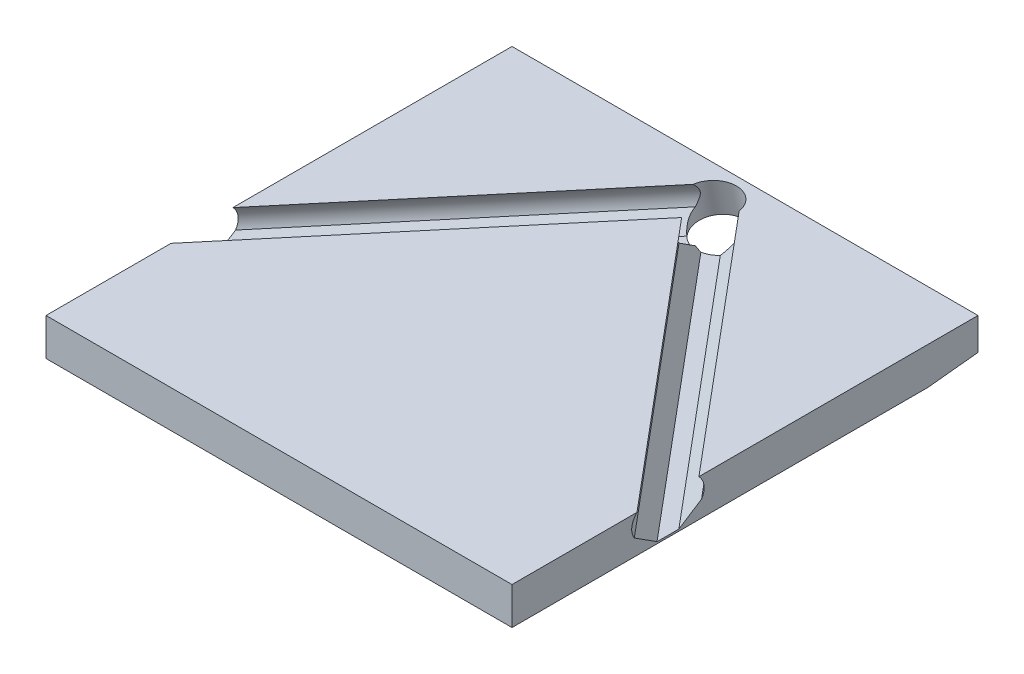
ISO-10303-21;
HEADER;
FILE_DESCRIPTION(('STEP AP214'),'2;1');
FILE_NAME('part.step','',(''),(''),'','','');
FILE_SCHEMA(('AUTOMOTIVE_DESIGN { 1 0 10303 214 1 1 1 1 }'));
ENDSEC;
DATA;
#1=APPLICATION_CONTEXT('core data for automotive mechanical design processes');
#2=APPLICATION_PROTOCOL_DEFINITION('international standard','automotive_design',2000,#1);
#3=PRODUCT_CONTEXT('',#1,'mechanical');
#4=PRODUCT('Part','Part','',(#3));
#5=PRODUCT_RELATED_PRODUCT_CATEGORY('part','',(#4));
#6=PRODUCT_DEFINITION_FORMATION('','',#4);
#7=PRODUCT_DEFINITION_CONTEXT('part definition',#1,'design');
#8=PRODUCT_DEFINITION('design','',#6,#7);
#9=PRODUCT_DEFINITION_SHAPE('','',#8);
#10=(LENGTH_UNIT() NAMED_UNIT(*) SI_UNIT(.MILLI.,.METRE.));
#11=(NAMED_UNIT(*) PLANE_ANGLE_UNIT() SI_UNIT($,.RADIAN.));
#12=(NAMED_UNIT(*) SI_UNIT($,.STERADIAN.) SOLID_ANGLE_UNIT());
#13=UNCERTAINTY_MEASURE_WITH_UNIT(LENGTH_MEASURE(1.E-05),#10,'distance_accuracy_value','');
#14=(GEOMETRIC_REPRESENTATION_CONTEXT(3) GLOBAL_UNCERTAINTY_ASSIGNED_CONTEXT((#13)) GLOBAL_UNIT_ASSIGNED_CONTEXT((#10,
#11,#12)) REPRESENTATION_CONTEXT('',''));
#15=CARTESIAN_POINT('',(0.,0.,0.));
#16=DIRECTION('',(0.,0.,1.));
#17=DIRECTION('',(1.,0.,0.));
#18=AXIS2_PLACEMENT_3D('',#15,#16,#17);
#19=CARTESIAN_POINT('',(0.,20.,0.));
#20=DIRECTION('',(0.,-1.,0.));
#21=DIRECTION('',(0.,0.,-1.));
#22=AXIS2_PLACEMENT_3D('',#19,#20,#21);
#23=PLANE('',#22);
#24=CARTESIAN_POINT('',(0.,20.,-107.622769024237));
#25=DIRECTION('',(0.,-1.,0.));
#26=DIRECTION('',(0.,0.,-1.));
#27=AXIS2_PLACEMENT_3D('',#24,#25,#26);
#28=ELLIPSE('',#27,12.7792574358128,12.5);
#29=CARTESIAN_POINT('',(-12.3647422840942,20.,-109.497628023604));
#30=VERTEX_POINT('',#29);
#31=CARTESIAN_POINT('',(12.3647422840941,20.,-109.497628023605));
#32=VERTEX_POINT('',#31);
#33=EDGE_CURVE('E254',#30,#32,#28,.T.);
#34=ORIENTED_EDGE('',*,*,#33,.T.);
#35=DIRECTION('',(-0.64278760968654,0.,-0.766044443118977));
#36=VECTOR('',#35,1.);
#37=CARTESIAN_POINT('',(174.370458590651,20.,83.5732664055318));
#38=LINE('',#37,#36);
#39=CARTESIAN_POINT('',(125.,20.,24.7358450121005));
#40=VERTEX_POINT('',#39);
#41=EDGE_CURVE('E312',#40,#32,#38,.T.);
#42=ORIENTED_EDGE('',*,*,#41,.F.);
#43=DIRECTION('',(0.,0.,-1.));
#44=VECTOR('',#43,1.);
#45=CARTESIAN_POINT('',(125.,20.,125.));
#46=LINE('',#45,#44);
#47=CARTESIAN_POINT('',(125.,20.,-125.));
#48=VERTEX_POINT('',#47);
#49=EDGE_CURVE('E270',#40,#48,#46,.T.);
#50=ORIENTED_EDGE('',*,*,#49,.T.);
#51=DIRECTION('',(-1.,0.,0.));
#52=VECTOR('',#51,1.);
#53=CARTESIAN_POINT('',(-125.,20.,-125.));
#54=LINE('',#53,#52);
#55=CARTESIAN_POINT('',(-125.,20.,-125.));
#56=VERTEX_POINT('',#55);
#57=EDGE_CURVE('E269',#48,#56,#54,.T.);
#58=ORIENTED_EDGE('',*,*,#57,.T.);
#59=DIRECTION('',(0.,0.,1.));
#60=VECTOR('',#59,1.);
#61=CARTESIAN_POINT('',(-125.,20.,125.));
#62=LINE('',#61,#60);
#63=CARTESIAN_POINT('',(-125.,20.,24.7358450121043));
#64=VERTEX_POINT('',#63);
#65=EDGE_CURVE('E273',#56,#64,#62,.T.);
#66=ORIENTED_EDGE('',*,*,#65,.T.);
#67=DIRECTION('',(0.64278760968653,0.,-0.766044443118986));
#68=VECTOR('',#67,1.);
#69=CARTESIAN_POINT('',(-174.370458590648,20.,83.5732664055347));
#70=LINE('',#69,#68);
#71=EDGE_CURVE('E224',#64,#30,#70,.T.);
#72=ORIENTED_EDGE('',*,*,#71,.T.);
#73=EDGE_LOOP('',(#34,#42,#50,#58,#66,#72));
#74=FACE_BOUND('',#73,.T.);
#75=ADVANCED_FACE('F33',(#74),#23,.F.);
#76=CARTESIAN_POINT('',(-125.,20.,125.));
#77=DIRECTION('',(1.,0.,0.));
#78=DIRECTION('',(0.,0.,-1.));
#79=AXIS2_PLACEMENT_3D('',#76,#77,#78);
#80=PLANE('',#79);
#81=CARTESIAN_POINT('',(-125.,13.5,41.3464300500428));
#82=DIRECTION('',(1.,0.,0.));
#83=DIRECTION('',(0.,0.,-1.));
#84=AXIS2_PLACEMENT_3D('',#81,#82,#83);
#85=ELLIPSE('',#84,19.4465478357555,12.5);
#86=CARTESIAN_POINT('',(-125.,8.83237363149247,23.3065216510025));
#87=VERTEX_POINT('',#86);
#88=EDGE_CURVE('E251',#64,#87,#85,.F.);
#89=ORIENTED_EDGE('',*,*,#88,.F.);
#90=ORIENTED_EDGE('',*,*,#65,.F.);
#91=DIRECTION('',(0.,-1.,0.));
#92=VECTOR('',#91,1.);
#93=CARTESIAN_POINT('',(-125.,20.,-125.));
#94=LINE('',#93,#92);
#95=CARTESIAN_POINT('',(-125.,2.82226850822647,-125.));
#96=VERTEX_POINT('',#95);
#97=EDGE_CURVE('E290',#56,#96,#94,.T.);
#98=ORIENTED_EDGE('',*,*,#97,.T.);
#99=DIRECTION('',(0.,-0.104528463267647,0.994521895368274));
#100=VECTOR('',#99,1.);
#101=CARTESIAN_POINT('',(-125.,0.,-98.1479088250566));
#102=LINE('',#101,#100);
#103=CARTESIAN_POINT('',(-125.,0.,-98.1479088250566));
#104=VERTEX_POINT('',#103);
#105=EDGE_CURVE('E257',#96,#104,#102,.T.);
#106=ORIENTED_EDGE('',*,*,#105,.T.);
#107=DIRECTION('',(0.,0.,1.));
#108=VECTOR('',#107,1.);
#109=CARTESIAN_POINT('',(-125.,0.,125.));
#110=LINE('',#109,#108);
#111=CARTESIAN_POINT('',(-125.,0.,125.));
#112=VERTEX_POINT('',#111);
#113=EDGE_CURVE('E281',#104,#112,#110,.T.);
#114=ORIENTED_EDGE('',*,*,#113,.T.);
#115=DIRECTION('',(0.,-1.,0.));
#116=VECTOR('',#115,1.);
#117=CARTESIAN_POINT('',(-125.,20.,125.));
#118=LINE('',#117,#116);
#119=CARTESIAN_POINT('',(-125.,20.,125.));
#120=VERTEX_POINT('',#119);
#121=EDGE_CURVE('E287',#120,#112,#118,.T.);
#122=ORIENTED_EDGE('',*,*,#121,.F.);
#123=CARTESIAN_POINT('',(-125.,20.,57.9570150879813));
#124=VERTEX_POINT('',#123);
#125=EDGE_CURVE('E272',#124,#120,#62,.T.);
#126=ORIENTED_EDGE('',*,*,#125,.F.);
#127=CARTESIAN_POINT('',(-125.,13.5,41.3464300500428));
#128=DIRECTION('',(1.,0.,0.));
#129=DIRECTION('',(0.,0.,-1.));
#130=AXIS2_PLACEMENT_3D('',#127,#128,#129);
#131=ELLIPSE('',#130,19.4465478357555,12.5);
#132=CARTESIAN_POINT('',(-125.,8.83237363149246,59.3863384490831));
#133=VERTEX_POINT('',#132);
#134=EDGE_CURVE('E243',#133,#124,#131,.F.);
#135=ORIENTED_EDGE('',*,*,#134,.F.);
#136=DIRECTION('',(0.,0.540716203060932,0.841205080671395));
#137=VECTOR('',#136,1.);
#138=CARTESIAN_POINT('',(-125.,41.9420824099609,110.895901296156));
#139=LINE('',#138,#137);
#140=CARTESIAN_POINT('',(-125.,1.,47.2013281696969));
#141=VERTEX_POINT('',#140);
#142=EDGE_CURVE('E245',#141,#133,#139,.T.);
#143=ORIENTED_EDGE('',*,*,#142,.F.);
#144=DIRECTION('',(0.,0.,1.));
#145=VECTOR('',#144,1.);
#146=CARTESIAN_POINT('',(-125.,1.,125.));
#147=LINE('',#146,#145);
#148=CARTESIAN_POINT('',(-125.,1.,35.4915319303887));
#149=VERTEX_POINT('',#148);
#150=EDGE_CURVE('E247',#149,#141,#147,.T.);
#151=ORIENTED_EDGE('',*,*,#150,.F.);
#152=DIRECTION('',(0.,-0.540716203060932,0.841205080671395));
#153=VECTOR('',#152,1.);
#154=CARTESIAN_POINT('',(-125.,-34.1581084367564,90.1878389327933));
#155=LINE('',#154,#153);
#156=EDGE_CURVE('E249',#87,#149,#155,.T.);
#157=ORIENTED_EDGE('',*,*,#156,.F.);
#158=EDGE_LOOP('',(#89,#90,#98,#106,#114,#122,#126,#135,#143,#151,#157));
#159=FACE_BOUND('',#158,.T.);
#160=ADVANCED_FACE('F315',(#159),#80,.F.);
#161=CARTESIAN_POINT('',(125.,20.,125.));
#162=VERTEX_POINT('',#161);
#163=CARTESIAN_POINT('',(125.,20.,57.9570150879769));
#164=VERTEX_POINT('',#163);
#165=EDGE_CURVE('E266',#162,#164,#46,.T.);
#166=ORIENTED_EDGE('',*,*,#165,.T.);
#167=DIRECTION('',(-0.64278760968654,0.,-0.766044443118977));
#168=VECTOR('',#167,1.);
#169=CARTESIAN_POINT('',(158.01222566322,20.,97.2994536216505));
#170=LINE('',#169,#168);
#171=CARTESIAN_POINT('',(0.,20.,-91.0121839862988));
#172=VERTEX_POINT('',#171);
#173=EDGE_CURVE('E330',#164,#172,#170,.T.);
#174=ORIENTED_EDGE('',*,*,#173,.T.);
#175=DIRECTION('',(0.64278760968653,0.,-0.766044443118986));
#176=VECTOR('',#175,1.);
#177=CARTESIAN_POINT('',(-158.012225663218,20.,97.2994536216532));
#178=LINE('',#177,#176);
#179=EDGE_CURVE('E228',#124,#172,#178,.T.);
#180=ORIENTED_EDGE('',*,*,#179,.F.);
#181=ORIENTED_EDGE('',*,*,#125,.T.);
#182=DIRECTION('',(1.,0.,0.));
#183=VECTOR('',#182,1.);
#184=CARTESIAN_POINT('',(-125.,20.,125.));
#185=LINE('',#184,#183);
#186=EDGE_CURVE('E276',#120,#162,#185,.T.);
#187=ORIENTED_EDGE('',*,*,#186,.T.);
#188=EDGE_LOOP('',(#166,#174,#180,#181,#187));
#189=FACE_BOUND('',#188,.T.);
#190=ADVANCED_FACE('F329',(#189),#23,.F.);
#191=CARTESIAN_POINT('',(0.,67.3081020879564,-97.567121505287));
#192=DIRECTION('',(0.,-0.978147600733807,-0.207911690817753));
#193=DIRECTION('',(0.,0.207911690817753,-0.978147600733807));
#194=AXIS2_PLACEMENT_3D('',#191,#192,#193);
#195=CYLINDRICAL_SURFACE('',#194,12.5);
#196=CARTESIAN_POINT('',(0.,1.41113425411322,-111.573954412528));
#197=DIRECTION('',(0.,0.994521895368274,0.104528463267647));
#198=DIRECTION('',(0.,0.104528463267647,-0.994521895368274));
#199=AXIS2_PLACEMENT_3D('',#196,#197,#198);
#200=ELLIPSE('',#199,12.568853494544,12.5);
#201=CARTESIAN_POINT('',(0.,2.7249371949341,-124.073954412528));
#202=VERTEX_POINT('',#201);
#203=EDGE_CURVE('E253',#202,#202,#200,.T.);
#204=ORIENTED_EDGE('',*,*,#203,.F.);
#205=EDGE_LOOP('',(#204));
#206=FACE_BOUND('',#205,.T.);
#207=CARTESIAN_POINT('',(0.,-0.0271693673157963,-111.879675284937));
#208=DIRECTION('',(0.541675220419703,-0.707106781186545,-0.454519477672046));
#209=DIRECTION('',(-0.689029180719739,-0.683223218529419,0.241753638605475));
#210=AXIS2_PLACEMENT_3D('',#207,#208,#209);
#211=ELLIPSE('',#210,15.9001781303028,12.5);
#212=CARTESIAN_POINT('',(8.981785849563,1.,-102.773591589763));
#213=VERTEX_POINT('',#212);
#214=CARTESIAN_POINT('',(12.4755847306921,8.83237363149249,-110.794854500761));
#215=VERTEX_POINT('',#214);
#216=EDGE_CURVE('E343',#213,#215,#211,.F.);
#217=ORIENTED_EDGE('',*,*,#216,.T.);
#218=CARTESIAN_POINT('',(12.4755847306921,8.83237363149249,-110.794854500761));
#219=CARTESIAN_POINT('',(12.4648743424763,9.02624699275766,-110.928989366624));
#220=CARTESIAN_POINT('',(12.450738008659,9.22224607409211,-111.059821205916));
#221=CARTESIAN_POINT('',(12.4164957910381,9.61892271071571,-111.31371791369));
#222=CARTESIAN_POINT('',(12.3963850869966,9.81960392270352,-111.436776412898));
#223=CARTESIAN_POINT('',(12.3506284990318,10.229957925221,-111.67619420506));
#224=CARTESIAN_POINT('',(12.324876765416,10.4397308352499,-111.792362374131));
#225=CARTESIAN_POINT('',(12.269354999648,10.8646854025729,-112.013215349565));
#226=CARTESIAN_POINT('',(12.2395861298773,11.079865480669,-112.117903461922));
#227=CARTESIAN_POINT('',(12.1827150122329,11.4806734313091,-112.297264889555));
#228=CARTESIAN_POINT('',(12.1559687187927,11.6654030124678,-112.374049342405));
#229=CARTESIAN_POINT('',(12.1020681701513,12.0394322605579,-112.515657112121));
#230=CARTESIAN_POINT('',(12.0749138362894,12.228732813048,-112.580478089869));
#231=CARTESIAN_POINT('',(12.0219980102449,12.6106470677967,-112.695051109008));
#232=CARTESIAN_POINT('',(11.9962281937633,12.8032288588239,-112.744904130569));
#233=CARTESIAN_POINT('',(11.9478483553744,13.1925223975972,-112.82689824172));
#234=CARTESIAN_POINT('',(11.9252362189182,13.3892312791072,-112.859051227048));
#235=CARTESIAN_POINT('',(11.891495564315,13.7243253588,-112.895621436744));
#236=CARTESIAN_POINT('',(11.8789767596219,13.8619729526311,-112.90553622686));
#237=CARTESIAN_POINT('',(11.8571583346082,14.1378609592707,-112.914356631278));
#238=CARTESIAN_POINT('',(11.8478576205574,14.2761011544687,-112.913265989799));
#239=CARTESIAN_POINT('',(11.8330034159519,14.5520562792821,-112.899487575695));
#240=CARTESIAN_POINT('',(11.8274456035845,14.6897716315045,-112.886813218444));
#241=CARTESIAN_POINT('',(11.8203257732398,14.96373387145,-112.849803606668));
#242=CARTESIAN_POINT('',(11.8187638634707,15.099980719307,-112.825468036383));
#243=CARTESIAN_POINT('',(11.8195949985817,15.3694749134323,-112.76571695511));
#244=CARTESIAN_POINT('',(11.8219736123873,15.5027314010167,-112.730342256644));
#245=CARTESIAN_POINT('',(11.8303395514065,15.7660172376679,-112.649393619874));
#246=CARTESIAN_POINT('',(11.8363284808859,15.8960451253272,-112.603815153126));
#247=CARTESIAN_POINT('',(11.8590040560242,16.2810806988433,-112.453281102619));
#248=CARTESIAN_POINT('',(11.880394358361,16.5305067654355,-112.334652626141));
#249=CARTESIAN_POINT('',(11.930223968475,17.0076941565962,-112.073952006935));
#250=CARTESIAN_POINT('',(11.958482881031,17.2358304381755,-111.932506867876));
#251=CARTESIAN_POINT('',(12.0183571626473,17.6791574296129,-111.630953556777));
#252=CARTESIAN_POINT('',(12.0499762281722,17.8943334658634,-111.47082481176));
#253=CARTESIAN_POINT('',(12.1136540966491,18.3139216936677,-111.136337957903));
#254=CARTESIAN_POINT('',(12.1457137275861,18.5183086305641,-110.961948705051));
#255=CARTESIAN_POINT('',(12.2080178321911,18.9174602278427,-110.602438039882));
#256=CARTESIAN_POINT('',(12.2382632350133,19.1122298045457,-110.417322218336));
#257=CARTESIAN_POINT('',(12.2847030431635,19.4223986620704,-110.109062069792));
#258=CARTESIAN_POINT('',(12.3019294754951,19.5402973583522,-109.988566139207));
#259=CARTESIAN_POINT('',(12.3346679042662,19.7725784032778,-109.745032826571));
#260=CARTESIAN_POINT('',(12.3501871733182,19.8869740404749,-109.622009104232));
#261=CARTESIAN_POINT('',(12.3647422840942,20.,-109.497628023605));
#262=B_SPLINE_CURVE_WITH_KNOTS('',3,(#218,#219,#220,#221,#222,#223,#224,#225,#226,#227,#228,
#229,#230,#231,#232,#233,#234,#235,#236,#237,#238,#239,#240,#241,#242,#243,#244,#245,#246,#247,
#248,#249,#250,#251,#252,#253,#254,#255,#256,#257,#258,#259,#260,#261),.UNSPECIFIED.,.F.,.F.,(4,
2,2,2,2,2,2,2,2,2,2,2,2,2,2,2,2,2,2,2,2,4),(0.,0.707965718568415,1.41650419615835,
2.13969265308808,2.86267229821533,3.46783865625631,4.07312321230637,4.67422743440775,
5.27492717510848,5.69022310618073,6.10537775195164,6.5200522057919,6.93473788879115,
7.34790825514169,7.76126235172814,8.58959707034554,9.39816480119278,10.2076314208177,
11.018915661052,11.8297807919688,12.3380996822119,12.844161600065),.UNSPECIFIED.);
#263=EDGE_CURVE('E217',#215,#32,#262,.T.);
#264=ORIENTED_EDGE('',*,*,#263,.T.);
#265=ORIENTED_EDGE('',*,*,#33,.F.);
#266=CARTESIAN_POINT('',(-12.475584730692,8.83237363149246,-110.794854500761));
#267=CARTESIAN_POINT('',(-12.4648743424762,9.02624699275767,-110.928989366624));
#268=CARTESIAN_POINT('',(-12.4507380086589,9.22224607409211,-111.059821205916));
#269=CARTESIAN_POINT('',(-12.4164957910381,9.61892271071571,-111.31371791369));
#270=CARTESIAN_POINT('',(-12.3963850869966,9.81960392270351,-111.436776412898));
#271=CARTESIAN_POINT('',(-12.3506284990318,10.229957925221,-111.676194205059));
#272=CARTESIAN_POINT('',(-12.324876765416,10.4397308352499,-111.792362374131));
#273=CARTESIAN_POINT('',(-12.269354999648,10.8646854025729,-112.013215349565));
#274=CARTESIAN_POINT('',(-12.2395861298773,11.079865480669,-112.117903461922));
#275=CARTESIAN_POINT('',(-12.1827150122329,11.4806734313091,-112.297264889555));
#276=CARTESIAN_POINT('',(-12.1559687187927,11.6654030124678,-112.374049342405));
#277=CARTESIAN_POINT('',(-12.1020681701513,12.0394322605578,-112.515657112121));
#278=CARTESIAN_POINT('',(-12.0749138362894,12.228732813048,-112.580478089869));
#279=CARTESIAN_POINT('',(-12.0219980102449,12.6106470677967,-112.695051109008));
#280=CARTESIAN_POINT('',(-11.9962281937633,12.8032288588239,-112.744904130569));
#281=CARTESIAN_POINT('',(-11.9478483553744,13.1925223975972,-112.82689824172));
#282=CARTESIAN_POINT('',(-11.9252362189182,13.3892312791073,-112.859051227048));
#283=CARTESIAN_POINT('',(-11.891495564315,13.7243253588001,-112.895621436744));
#284=CARTESIAN_POINT('',(-11.8789767596219,13.8619729526311,-112.90553622686));
#285=CARTESIAN_POINT('',(-11.8571583346082,14.1378609592707,-112.914356631278));
#286=CARTESIAN_POINT('',(-11.8478576205573,14.2761011544687,-112.913265989799));
#287=CARTESIAN_POINT('',(-11.8330034159519,14.5520562792822,-112.899487575695));
#288=CARTESIAN_POINT('',(-11.8274456035845,14.6897716315045,-112.886813218444));
#289=CARTESIAN_POINT('',(-11.8203257732398,14.9637338714501,-112.849803606668));
#290=CARTESIAN_POINT('',(-11.8187638634706,15.099980719307,-112.825468036383));
#291=CARTESIAN_POINT('',(-11.8195949985817,15.3694749134323,-112.76571695511));
#292=CARTESIAN_POINT('',(-11.8219736123872,15.5027314010167,-112.730342256644));
#293=CARTESIAN_POINT('',(-11.8303395514064,15.7660172376679,-112.649393619874));
#294=CARTESIAN_POINT('',(-11.8363284808858,15.8960451253272,-112.603815153126));
#295=CARTESIAN_POINT('',(-11.8590040560241,16.2810806988433,-112.453281102619));
#296=CARTESIAN_POINT('',(-11.880394358361,16.5305067654355,-112.33465262614));
#297=CARTESIAN_POINT('',(-11.930223968475,17.0076941565962,-112.073952006935));
#298=CARTESIAN_POINT('',(-11.958482881031,17.2358304381756,-111.932506867876));
#299=CARTESIAN_POINT('',(-12.0183571626473,17.679157429613,-111.630953556777));
#300=CARTESIAN_POINT('',(-12.0499762281722,17.8943334658634,-111.47082481176));
#301=CARTESIAN_POINT('',(-12.1136540966491,18.3139216936678,-111.136337957903));
#302=CARTESIAN_POINT('',(-12.1457137275861,18.5183086305642,-110.961948705051));
#303=CARTESIAN_POINT('',(-12.2080178321911,18.9174602278428,-110.602438039882));
#304=CARTESIAN_POINT('',(-12.2382632350133,19.1122298045458,-110.417322218336));
#305=CARTESIAN_POINT('',(-12.2847030431635,19.4223986620705,-110.109062069792));
#306=CARTESIAN_POINT('',(-12.3019294754951,19.5402973583522,-109.988566139207));
#307=CARTESIAN_POINT('',(-12.3346679042662,19.7725784032779,-109.745032826571));
#308=CARTESIAN_POINT('',(-12.3501871733182,19.8869740404749,-109.622009104232));
#309=CARTESIAN_POINT('',(-12.3647422840941,20.,-109.497628023605));
#310=B_SPLINE_CURVE_WITH_KNOTS('',3,(#266,#267,#268,#269,#270,#271,#272,#273,#274,#275,#276,
#277,#278,#279,#280,#281,#282,#283,#284,#285,#286,#287,#288,#289,#290,#291,#292,#293,#294,#295,
#296,#297,#298,#299,#300,#301,#302,#303,#304,#305,#306,#307,#308,#309),.UNSPECIFIED.,.F.,.F.,(4,
2,2,2,2,2,2,2,2,2,2,2,2,2,2,2,2,2,2,2,2,4),(0.,0.707965718568424,1.41650419615837,
2.13969265308806,2.86267229821532,3.46783865625631,4.07312321230637,4.67422743440776,
5.27492717510852,5.69022310618078,6.10537775195168,6.52005220579192,6.93473788879116,
7.34790825514169,7.76126235172814,8.58959707034555,9.39816480119284,10.2076314208178,
11.0189156610522,11.829780791969,12.338099682212,12.8441616000651),.UNSPECIFIED.);
#311=CARTESIAN_POINT('',(-12.4755847306921,8.83237363149247,-110.794854500761));
#312=VERTEX_POINT('',#311);
#313=EDGE_CURVE('E175',#312,#30,#310,.T.);
#314=ORIENTED_EDGE('',*,*,#313,.F.);
#315=CARTESIAN_POINT('',(0.,-0.0271693673158241,-111.879675284937));
#316=DIRECTION('',(0.541675220419708,0.707106781186546,0.454519477672038));
#317=DIRECTION('',(0.689029180719745,-0.683223218529417,0.241753638605464));
#318=AXIS2_PLACEMENT_3D('',#315,#316,#317);
#319=ELLIPSE('',#318,15.9001781303028,12.5);
#320=CARTESIAN_POINT('',(-8.98178584956288,1.,-102.773591589763));
#321=VERTEX_POINT('',#320);
#322=EDGE_CURVE('E182',#321,#312,#319,.F.);
#323=ORIENTED_EDGE('',*,*,#322,.F.);
#324=CARTESIAN_POINT('',(0.,1.,-111.661343695967));
#325=DIRECTION('',(0.,1.,0.));
#326=DIRECTION('',(0.,0.,-1.));
#327=AXIS2_PLACEMENT_3D('',#324,#325,#326);
#328=ELLIPSE('',#327,12.7792574358128,12.5);
#329=CARTESIAN_POINT('',(-2.246816165865,1.,-99.0902196670146));
#330=VERTEX_POINT('',#329);
#331=EDGE_CURVE('E299',#330,#321,#328,.F.);
#332=ORIENTED_EDGE('',*,*,#331,.F.);
#333=CARTESIAN_POINT('',(0.,-6.36577866940634,-113.226988283959));
#334=DIRECTION('',(-0.541675220419708,0.707106781186547,-0.454519477672038));
#335=DIRECTION('',(-0.403258373417666,-0.693027485157282,-0.597574756064136));
#336=AXIS2_PLACEMENT_3D('',#333,#334,#335);
#337=ELLIPSE('',#336,20.9325926045176,12.5);
#338=CARTESIAN_POINT('',(1.00511862689389E-13,3.14849238752064,-98.4254101054889));
#339=VERTEX_POINT('',#338);
#340=EDGE_CURVE('E296',#339,#330,#337,.F.);
#341=ORIENTED_EDGE('',*,*,#340,.F.);
#342=CARTESIAN_POINT('',(0.,-6.36577866940641,-113.226988283959));
#343=DIRECTION('',(-0.541675220419702,-0.707106781186546,0.454519477672045));
#344=DIRECTION('',(0.403258373417659,-0.693027485157284,-0.597574756064139));
#345=AXIS2_PLACEMENT_3D('',#342,#343,#344);
#346=ELLIPSE('',#345,20.9325926045177,12.5);
#347=CARTESIAN_POINT('',(2.24681616586508,1.,-99.0902196670147));
#348=VERTEX_POINT('',#347);
#349=EDGE_CURVE('E158',#339,#348,#346,.F.);
#350=ORIENTED_EDGE('',*,*,#349,.T.);
#351=CARTESIAN_POINT('',(0.,1.,-111.661343695967));
#352=DIRECTION('',(0.,-1.,0.));
#353=DIRECTION('',(0.,0.,-1.));
#354=AXIS2_PLACEMENT_3D('',#351,#352,#353);
#355=ELLIPSE('',#354,12.7792574358128,12.5);
#356=EDGE_CURVE('E165',#348,#213,#355,.F.);
#357=ORIENTED_EDGE('',*,*,#356,.T.);
#358=EDGE_LOOP('',(#217,#264,#265,#314,#323,#332,#341,#350,#357));
#359=FACE_BOUND('',#358,.T.);
#360=ADVANCED_FACE('F184',(#206,#359),#195,.F.);
#361=CARTESIAN_POINT('',(125.,20.,125.));
#362=DIRECTION('',(-1.,0.,0.));
#363=DIRECTION('',(0.,0.,1.));
#364=AXIS2_PLACEMENT_3D('',#361,#362,#363);
#365=PLANE('',#364);
#366=ORIENTED_EDGE('',*,*,#49,.F.);
#367=CARTESIAN_POINT('',(125.,13.5,41.3464300500387));
#368=DIRECTION('',(-1.,0.,0.));
#369=DIRECTION('',(0.,0.,-1.));
#370=AXIS2_PLACEMENT_3D('',#367,#368,#369);
#371=ELLIPSE('',#370,19.4465478357551,12.5);
#372=CARTESIAN_POINT('',(125.,8.83237363149249,23.3065216509987));
#373=VERTEX_POINT('',#372);
#374=EDGE_CURVE('E11',#40,#373,#371,.T.);
#375=ORIENTED_EDGE('',*,*,#374,.T.);
#376=DIRECTION('',(0.,-0.54071620306094,0.84120508067139));
#377=VECTOR('',#376,1.);
#378=CARTESIAN_POINT('',(125.,-34.1581084367584,90.1878389327913));
#379=LINE('',#378,#377);
#380=CARTESIAN_POINT('',(125.,0.999999999999997,35.4915319303847));
#381=VERTEX_POINT('',#380);
#382=EDGE_CURVE('E170',#373,#381,#379,.T.);
#383=ORIENTED_EDGE('',*,*,#382,.T.);
#384=DIRECTION('',(0.,0.,1.));
#385=VECTOR('',#384,1.);
#386=CARTESIAN_POINT('',(125.,1.,125.));
#387=LINE('',#386,#385);
#388=CARTESIAN_POINT('',(125.,1.,47.2013281696927));
#389=VERTEX_POINT('',#388);
#390=EDGE_CURVE('E41',#381,#389,#387,.T.);
#391=ORIENTED_EDGE('',*,*,#390,.T.);
#392=DIRECTION('',(0.,0.540716203060939,0.841205080671391));
#393=VECTOR('',#392,1.);
#394=CARTESIAN_POINT('',(125.,41.9420824099632,110.895901296155));
#395=LINE('',#394,#393);
#396=CARTESIAN_POINT('',(125.,8.83237363149247,59.3863384490787));
#397=VERTEX_POINT('',#396);
#398=EDGE_CURVE('E149',#389,#397,#395,.T.);
#399=ORIENTED_EDGE('',*,*,#398,.T.);
#400=CARTESIAN_POINT('',(125.,13.5,41.3464300500387));
#401=DIRECTION('',(-1.,0.,0.));
#402=DIRECTION('',(0.,0.,-1.));
#403=AXIS2_PLACEMENT_3D('',#400,#401,#402);
#404=ELLIPSE('',#403,19.4465478357551,12.5);
#405=EDGE_CURVE('E157',#397,#164,#404,.T.);
#406=ORIENTED_EDGE('',*,*,#405,.T.);
#407=ORIENTED_EDGE('',*,*,#165,.F.);
#408=DIRECTION('',(0.,-1.,0.));
#409=VECTOR('',#408,1.);
#410=CARTESIAN_POINT('',(125.,20.,125.));
#411=LINE('',#410,#409);
#412=CARTESIAN_POINT('',(125.,0.,125.));
#413=VERTEX_POINT('',#412);
#414=EDGE_CURVE('E278',#162,#413,#411,.T.);
#415=ORIENTED_EDGE('',*,*,#414,.T.);
#416=DIRECTION('',(0.,0.,-1.));
#417=VECTOR('',#416,1.);
#418=CARTESIAN_POINT('',(125.,0.,125.));
#419=LINE('',#418,#417);
#420=CARTESIAN_POINT('',(125.,0.,-98.1479088250566));
#421=VERTEX_POINT('',#420);
#422=EDGE_CURVE('E264',#413,#421,#419,.T.);
#423=ORIENTED_EDGE('',*,*,#422,.T.);
#424=DIRECTION('',(0.,-0.104528463267647,0.994521895368274));
#425=VECTOR('',#424,1.);
#426=CARTESIAN_POINT('',(125.,0.,-98.1479088250566));
#427=LINE('',#426,#425);
#428=CARTESIAN_POINT('',(125.,2.82226850822647,-125.));
#429=VERTEX_POINT('',#428);
#430=EDGE_CURVE('E56',#429,#421,#427,.T.);
#431=ORIENTED_EDGE('',*,*,#430,.F.);
#432=DIRECTION('',(0.,-1.,0.));
#433=VECTOR('',#432,1.);
#434=CARTESIAN_POINT('',(125.,20.,-125.));
#435=LINE('',#434,#433);
#436=EDGE_CURVE('E293',#48,#429,#435,.T.);
#437=ORIENTED_EDGE('',*,*,#436,.F.);
#438=EDGE_LOOP('',(#366,#375,#383,#391,#399,#406,#407,#415,#423,#431,#437));
#439=FACE_BOUND('',#438,.T.);
#440=ADVANCED_FACE('F35',(#439),#365,.F.);
#441=CARTESIAN_POINT('',(-125.,20.,-125.));
#442=DIRECTION('',(0.,0.,1.));
#443=DIRECTION('',(1.,0.,0.));
#444=AXIS2_PLACEMENT_3D('',#441,#442,#443);
#445=PLANE('',#444);
#446=ORIENTED_EDGE('',*,*,#436,.T.);
#447=DIRECTION('',(1.,0.,0.));
#448=VECTOR('',#447,1.);
#449=CARTESIAN_POINT('',(-125.,2.82226850822647,-125.));
#450=LINE('',#449,#448);
#451=EDGE_CURVE('E262',#96,#429,#450,.T.);
#452=ORIENTED_EDGE('',*,*,#451,.F.);
#453=ORIENTED_EDGE('',*,*,#97,.F.);
#454=ORIENTED_EDGE('',*,*,#57,.F.);
#455=EDGE_LOOP('',(#446,#452,#453,#454));
#456=FACE_BOUND('',#455,.T.);
#457=ADVANCED_FACE('F368',(#456),#445,.F.);
#458=CARTESIAN_POINT('',(-125.,20.,125.));
#459=DIRECTION('',(0.,0.,-1.));
#460=DIRECTION('',(-1.,0.,0.));
#461=AXIS2_PLACEMENT_3D('',#458,#459,#460);
#462=PLANE('',#461);
#463=DIRECTION('',(1.,0.,0.));
#464=VECTOR('',#463,1.);
#465=CARTESIAN_POINT('',(-125.,0.,125.));
#466=LINE('',#465,#464);
#467=EDGE_CURVE('E283',#112,#413,#466,.T.);
#468=ORIENTED_EDGE('',*,*,#467,.T.);
#469=ORIENTED_EDGE('',*,*,#414,.F.);
#470=ORIENTED_EDGE('',*,*,#186,.F.);
#471=ORIENTED_EDGE('',*,*,#121,.T.);
#472=EDGE_LOOP('',(#468,#469,#470,#471));
#473=FACE_BOUND('',#472,.T.);
#474=ADVANCED_FACE('F376',(#473),#462,.F.);
#475=CARTESIAN_POINT('',(0.,0.,0.));
#476=DIRECTION('',(0.,-1.,0.));
#477=DIRECTION('',(0.,0.,-1.));
#478=AXIS2_PLACEMENT_3D('',#475,#476,#477);
#479=PLANE('',#478);
#480=DIRECTION('',(1.,0.,0.));
#481=VECTOR('',#480,1.);
#482=CARTESIAN_POINT('',(-125.,0.,-98.1479088250566));
#483=LINE('',#482,#481);
#484=EDGE_CURVE('E260',#104,#421,#483,.T.);
#485=ORIENTED_EDGE('',*,*,#484,.T.);
#486=ORIENTED_EDGE('',*,*,#422,.F.);
#487=ORIENTED_EDGE('',*,*,#467,.F.);
#488=ORIENTED_EDGE('',*,*,#113,.F.);
#489=EDGE_LOOP('',(#485,#486,#487,#488));
#490=FACE_BOUND('',#489,.T.);
#491=ADVANCED_FACE('F372',(#490),#479,.T.);
#492=CARTESIAN_POINT('',(-125.,0.,-98.1479088250566));
#493=DIRECTION('',(0.,0.994521895368274,0.104528463267647));
#494=DIRECTION('',(0.,-0.104528463267647,0.994521895368274));
#495=AXIS2_PLACEMENT_3D('',#492,#493,#494);
#496=PLANE('',#495);
#497=ORIENTED_EDGE('',*,*,#203,.T.);
#498=EDGE_LOOP('',(#497));
#499=FACE_BOUND('',#498,.T.);
#500=ORIENTED_EDGE('',*,*,#430,.T.);
#501=ORIENTED_EDGE('',*,*,#484,.F.);
#502=ORIENTED_EDGE('',*,*,#105,.F.);
#503=ORIENTED_EDGE('',*,*,#451,.T.);
#504=EDGE_LOOP('',(#500,#501,#502,#503));
#505=FACE_BOUND('',#504,.T.);
#506=ADVANCED_FACE('F192',(#499,#505),#496,.F.);
#507=CARTESIAN_POINT('',(-166.191342126933,13.5,90.436360013594));
#508=DIRECTION('',(0.64278760968653,0.,-0.766044443118986));
#509=DIRECTION('',(-0.766044443118986,0.,-0.64278760968653));
#510=AXIS2_PLACEMENT_3D('',#507,#508,#509);
#511=CYLINDRICAL_SURFACE('',#510,12.5);
#512=ORIENTED_EDGE('',*,*,#88,.T.);
#513=DIRECTION('',(0.64278760968653,0.,-0.766044443118986));
#514=VECTOR('',#513,1.);
#515=CARTESIAN_POINT('',(-175.074262954436,8.83237363149247,82.9827044234599));
#516=LINE('',#515,#514);
#517=EDGE_CURVE('E240',#87,#312,#516,.T.);
#518=ORIENTED_EDGE('',*,*,#517,.T.);
#519=ORIENTED_EDGE('',*,*,#313,.T.);
#520=ORIENTED_EDGE('',*,*,#71,.F.);
#521=EDGE_LOOP('',(#512,#518,#519,#520));
#522=FACE_BOUND('',#521,.T.);
#523=ADVANCED_FACE('F187',(#522),#511,.F.);
#524=CARTESIAN_POINT('',(-175.074262954436,8.83237363149247,82.9827044234599));
#525=DIRECTION('',(0.541675220419708,0.707106781186546,0.454519477672038));
#526=DIRECTION('',(-0.793844806099442,0.608120402411348,0.));
#527=AXIS2_PLACEMENT_3D('',#524,#525,#526);
#528=PLANE('',#527);
#529=ORIENTED_EDGE('',*,*,#156,.T.);
#530=DIRECTION('',(0.64278760968653,0.,-0.766044443118986));
#531=VECTOR('',#530,1.);
#532=CARTESIAN_POINT('',(-169.074316657599,1.,88.0172571482187));
#533=LINE('',#532,#531);
#534=EDGE_CURVE('E237',#149,#321,#533,.T.);
#535=ORIENTED_EDGE('',*,*,#534,.T.);
#536=ORIENTED_EDGE('',*,*,#322,.T.);
#537=ORIENTED_EDGE('',*,*,#517,.F.);
#538=EDGE_LOOP('',(#529,#535,#536,#537));
#539=FACE_BOUND('',#538,.T.);
#540=ADVANCED_FACE('F191',(#539),#528,.T.);
#541=CARTESIAN_POINT('',(-169.074316657599,1.,88.0172571482187));
#542=DIRECTION('',(0.,1.,0.));
#543=DIRECTION('',(0.,0.,1.));
#544=AXIS2_PLACEMENT_3D('',#541,#542,#543);
#545=PLANE('',#544);
#546=ORIENTED_EDGE('',*,*,#150,.T.);
#547=DIRECTION('',(0.64278760968653,0.,-0.766044443118986));
#548=VECTOR('',#547,1.);
#549=CARTESIAN_POINT('',(-163.308367596267,1.,92.8554628789692));
#550=LINE('',#549,#548);
#551=EDGE_CURVE('E234',#141,#330,#550,.T.);
#552=ORIENTED_EDGE('',*,*,#551,.T.);
#553=ORIENTED_EDGE('',*,*,#331,.T.);
#554=ORIENTED_EDGE('',*,*,#534,.F.);
#555=EDGE_LOOP('',(#546,#552,#553,#554));
#556=FACE_BOUND('',#555,.T.);
#557=ADVANCED_FACE('F196',(#556),#545,.T.);
#558=CARTESIAN_POINT('',(-163.308367596267,1.,92.8554628789692));
#559=DIRECTION('',(-0.541675220419708,0.707106781186547,-0.454519477672038));
#560=DIRECTION('',(-0.793844806099442,-0.608120402411348,0.));
#561=AXIS2_PLACEMENT_3D('',#558,#559,#560);
#562=PLANE('',#561);
#563=DIRECTION('',(0.,0.540716203060936,0.841205080671393));
#564=VECTOR('',#563,1.);
#565=CARTESIAN_POINT('',(1.13797860024079E-12,89.5250495167912,35.9526579026873));
#566=LINE('',#565,#564);
#567=CARTESIAN_POINT('',(1.66533453693773E-13,8.83237363149246,-89.582860625197));
#568=VERTEX_POINT('',#567);
#569=EDGE_CURVE('E333',#339,#568,#566,.T.);
#570=ORIENTED_EDGE('',*,*,#569,.F.);
#571=ORIENTED_EDGE('',*,*,#340,.T.);
#572=ORIENTED_EDGE('',*,*,#551,.F.);
#573=ORIENTED_EDGE('',*,*,#142,.T.);
#574=DIRECTION('',(0.64278760968653,0.,-0.766044443118986));
#575=VECTOR('',#574,1.);
#576=CARTESIAN_POINT('',(-157.308421299431,8.83237363149246,97.890015603728));
#577=LINE('',#576,#575);
#578=EDGE_CURVE('E231',#133,#568,#577,.T.);
#579=ORIENTED_EDGE('',*,*,#578,.T.);
#580=EDGE_LOOP('',(#570,#571,#572,#573,#579));
#581=FACE_BOUND('',#580,.T.);
#582=ADVANCED_FACE('F200',(#581),#562,.T.);
#583=CARTESIAN_POINT('',(-166.191342126933,13.5,90.436360013594));
#584=DIRECTION('',(0.64278760968653,0.,-0.766044443118986));
#585=DIRECTION('',(-0.766044443118986,0.,-0.64278760968653));
#586=AXIS2_PLACEMENT_3D('',#583,#584,#585);
#587=CYLINDRICAL_SURFACE('',#586,12.5);
#588=CARTESIAN_POINT('',(0.,13.5,-107.622769024237));
#589=DIRECTION('',(1.,0.,0.));
#590=DIRECTION('',(0.,0.,-1.));
#591=AXIS2_PLACEMENT_3D('',#588,#589,#590);
#592=ELLIPSE('',#591,19.4465478357553,12.5);
#593=EDGE_CURVE('E171',#568,#172,#592,.F.);
#594=ORIENTED_EDGE('',*,*,#593,.F.);
#595=ORIENTED_EDGE('',*,*,#578,.F.);
#596=ORIENTED_EDGE('',*,*,#134,.T.);
#597=ORIENTED_EDGE('',*,*,#179,.T.);
#598=EDGE_LOOP('',(#594,#595,#596,#597));
#599=FACE_BOUND('',#598,.T.);
#600=ADVANCED_FACE('F204',(#599),#587,.F.);
#601=CARTESIAN_POINT('',(166.191342126936,13.5,90.4363600135912));
#602=DIRECTION('',(-0.64278760968654,0.,-0.766044443118977));
#603=DIRECTION('',(-0.766044443118977,0.,0.642787609686541));
#604=AXIS2_PLACEMENT_3D('',#601,#602,#603);
#605=CYLINDRICAL_SURFACE('',#604,12.5);
#606=DIRECTION('',(-0.64278760968654,0.,-0.766044443118977));
#607=VECTOR('',#606,1.);
#608=CARTESIAN_POINT('',(175.074262954438,8.83237363149249,82.982704423457));
#609=LINE('',#608,#607);
#610=EDGE_CURVE('E338',#373,#215,#609,.T.);
#611=ORIENTED_EDGE('',*,*,#610,.F.);
#612=ORIENTED_EDGE('',*,*,#374,.F.);
#613=ORIENTED_EDGE('',*,*,#41,.T.);
#614=ORIENTED_EDGE('',*,*,#263,.F.);
#615=EDGE_LOOP('',(#611,#612,#613,#614));
#616=FACE_BOUND('',#615,.T.);
#617=ADVANCED_FACE('F208',(#616),#605,.F.);
#618=CARTESIAN_POINT('',(169.074316657601,1.,88.0172571482159));
#619=DIRECTION('',(0.,-1.,0.));
#620=DIRECTION('',(0.,0.,-1.));
#621=AXIS2_PLACEMENT_3D('',#618,#619,#620);
#622=PLANE('',#621);
#623=DIRECTION('',(-0.64278760968654,0.,-0.766044443118977));
#624=VECTOR('',#623,1.);
#625=CARTESIAN_POINT('',(163.30836759627,1.,92.8554628789664));
#626=LINE('',#625,#624);
#627=EDGE_CURVE('E152',#389,#348,#626,.T.);
#628=ORIENTED_EDGE('',*,*,#627,.F.);
#629=ORIENTED_EDGE('',*,*,#390,.F.);
#630=DIRECTION('',(-0.64278760968654,0.,-0.766044443118977));
#631=VECTOR('',#630,1.);
#632=CARTESIAN_POINT('',(169.074316657601,1.,88.0172571482159));
#633=LINE('',#632,#631);
#634=EDGE_CURVE('E166',#381,#213,#633,.T.);
#635=ORIENTED_EDGE('',*,*,#634,.T.);
#636=ORIENTED_EDGE('',*,*,#356,.F.);
#637=EDGE_LOOP('',(#628,#629,#635,#636));
#638=FACE_BOUND('',#637,.T.);
#639=ADVANCED_FACE('F161',(#638),#622,.F.);
#640=CARTESIAN_POINT('',(175.074262954438,8.83237363149249,82.982704423457));
#641=DIRECTION('',(0.541675220419703,-0.707106781186545,-0.454519477672046));
#642=DIRECTION('',(0.793844806099444,0.608120402411345,0.));
#643=AXIS2_PLACEMENT_3D('',#640,#641,#642);
#644=PLANE('',#643);
#645=ORIENTED_EDGE('',*,*,#634,.F.);
#646=ORIENTED_EDGE('',*,*,#382,.F.);
#647=ORIENTED_EDGE('',*,*,#610,.T.);
#648=ORIENTED_EDGE('',*,*,#216,.F.);
#649=EDGE_LOOP('',(#645,#646,#647,#648));
#650=FACE_BOUND('',#649,.T.);
#651=ADVANCED_FACE('F214',(#650),#644,.F.);
#652=CARTESIAN_POINT('',(166.191342126936,13.5,90.4363600135912));
#653=DIRECTION('',(-0.64278760968654,0.,-0.766044443118977));
#654=DIRECTION('',(-0.766044443118977,0.,0.642787609686541));
#655=AXIS2_PLACEMENT_3D('',#652,#653,#654);
#656=CYLINDRICAL_SURFACE('',#655,12.5);
#657=DIRECTION('',(-0.64278760968654,0.,-0.766044443118977));
#658=VECTOR('',#657,1.);
#659=CARTESIAN_POINT('',(157.308421299433,8.83237363149248,97.8900156037254));
#660=LINE('',#659,#658);
#661=EDGE_CURVE('E48',#397,#568,#660,.T.);
#662=ORIENTED_EDGE('',*,*,#661,.T.);
#663=ORIENTED_EDGE('',*,*,#593,.T.);
#664=ORIENTED_EDGE('',*,*,#173,.F.);
#665=ORIENTED_EDGE('',*,*,#405,.F.);
#666=EDGE_LOOP('',(#662,#663,#664,#665));
#667=FACE_BOUND('',#666,.T.);
#668=ADVANCED_FACE('F344',(#667),#656,.F.);
#669=CARTESIAN_POINT('',(163.30836759627,1.,92.8554628789664));
#670=DIRECTION('',(-0.541675220419702,-0.707106781186546,0.454519477672045));
#671=DIRECTION('',(0.793844806099445,-0.608120402411344,0.));
#672=AXIS2_PLACEMENT_3D('',#669,#670,#671);
#673=PLANE('',#672);
#674=ORIENTED_EDGE('',*,*,#627,.T.);
#675=ORIENTED_EDGE('',*,*,#349,.F.);
#676=ORIENTED_EDGE('',*,*,#569,.T.);
#677=ORIENTED_EDGE('',*,*,#661,.F.);
#678=ORIENTED_EDGE('',*,*,#398,.F.);
#679=EDGE_LOOP('',(#674,#675,#676,#677,#678));
#680=FACE_BOUND('',#679,.T.);
#681=ADVANCED_FACE('F151',(#680),#673,.F.);
#682=CLOSED_SHELL('',(#75,#160,#190,#360,#440,#457,#474,#491,#506,#523,#540,#557,#582,#600,#617,
#639,#651,#668,#681));
#683=MANIFOLD_SOLID_BREP('B2',#682);
#684=ADVANCED_BREP_SHAPE_REPRESENTATION('',(#18,#683),#14);
#685=SHAPE_DEFINITION_REPRESENTATION(#9,#684);
ENDSEC;
END-ISO-10303-21;
